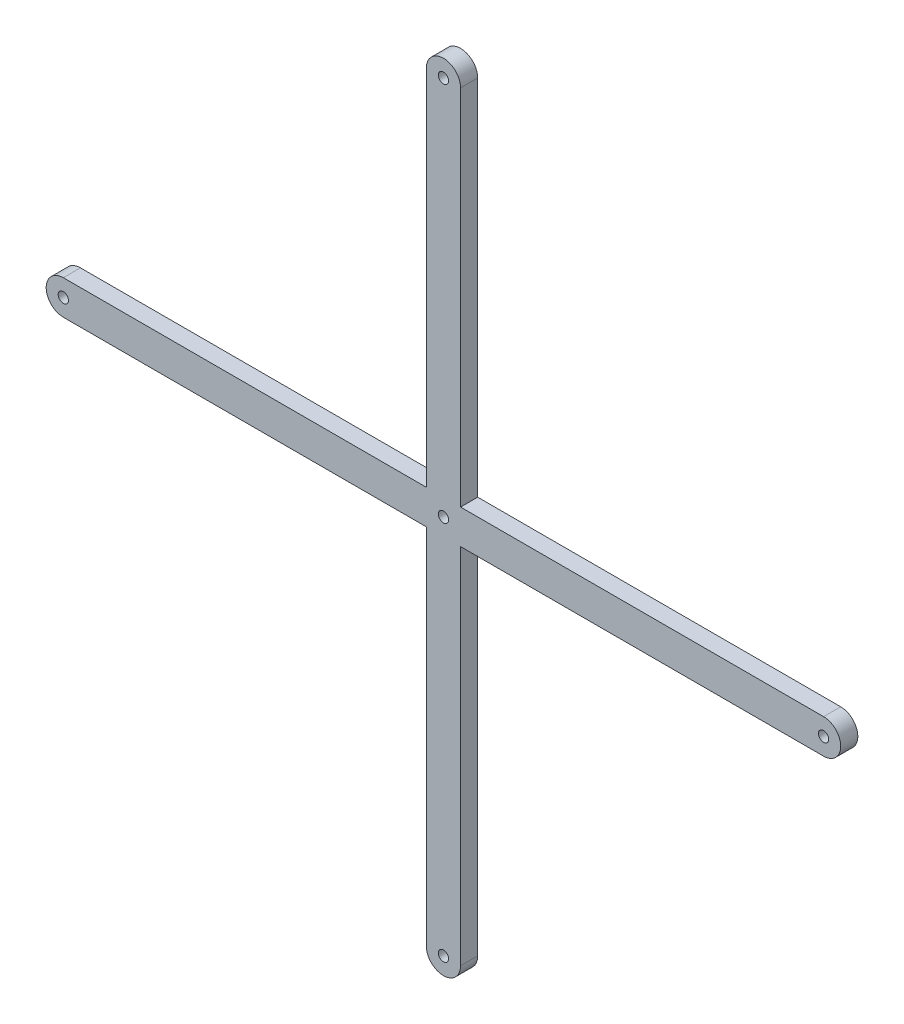
ISO-10303-21;
HEADER;
FILE_DESCRIPTION(('STEP AP214'),'2;1');
FILE_NAME('part.step','',(''),(''),'','','');
FILE_SCHEMA(('AUTOMOTIVE_DESIGN { 1 0 10303 214 1 1 1 1 }'));
ENDSEC;
DATA;
#1=APPLICATION_CONTEXT('core data for automotive mechanical design processes');
#2=APPLICATION_PROTOCOL_DEFINITION('international standard','automotive_design',2000,#1);
#3=PRODUCT_CONTEXT('',#1,'mechanical');
#4=PRODUCT('Part','Part','',(#3));
#5=PRODUCT_RELATED_PRODUCT_CATEGORY('part','',(#4));
#6=PRODUCT_DEFINITION_FORMATION('','',#4);
#7=PRODUCT_DEFINITION_CONTEXT('part definition',#1,'design');
#8=PRODUCT_DEFINITION('design','',#6,#7);
#9=PRODUCT_DEFINITION_SHAPE('','',#8);
#10=(LENGTH_UNIT() NAMED_UNIT(*) SI_UNIT(.MILLI.,.METRE.));
#11=(NAMED_UNIT(*) PLANE_ANGLE_UNIT() SI_UNIT($,.RADIAN.));
#12=(NAMED_UNIT(*) SI_UNIT($,.STERADIAN.) SOLID_ANGLE_UNIT());
#13=UNCERTAINTY_MEASURE_WITH_UNIT(LENGTH_MEASURE(1.E-05),#10,'distance_accuracy_value','');
#14=(GEOMETRIC_REPRESENTATION_CONTEXT(3) GLOBAL_UNCERTAINTY_ASSIGNED_CONTEXT((#13)) GLOBAL_UNIT_ASSIGNED_CONTEXT((#10,
#11,#12)) REPRESENTATION_CONTEXT('',''));
#15=CARTESIAN_POINT('',(0.,0.,0.));
#16=DIRECTION('',(0.,0.,1.));
#17=DIRECTION('',(1.,0.,0.));
#18=AXIS2_PLACEMENT_3D('',#15,#16,#17);
#19=CARTESIAN_POINT('',(0.,-111.,5.));
#20=DIRECTION('',(0.,0.,1.));
#21=DIRECTION('',(1.,0.,0.));
#22=AXIS2_PLACEMENT_3D('',#19,#20,#21);
#23=PLANE('',#22);
#24=CARTESIAN_POINT('',(7.6151527775264E-13,111.,5.));
#25=DIRECTION('',(0.,0.,1.));
#26=DIRECTION('',(1.,0.,0.));
#27=AXIS2_PLACEMENT_3D('',#24,#25,#26);
#28=CIRCLE('',#27,1.5);
#29=CARTESIAN_POINT('',(1.50000000000076,111.,5.));
#30=VERTEX_POINT('',#29);
#31=EDGE_CURVE('E300',#30,#30,#28,.T.);
#32=ORIENTED_EDGE('',*,*,#31,.F.);
#33=EDGE_LOOP('',(#32));
#34=FACE_BOUND('',#33,.T.);
#35=CARTESIAN_POINT('',(0.,-111.,5.));
#36=DIRECTION('',(0.,0.,1.));
#37=DIRECTION('',(1.,0.,0.));
#38=AXIS2_PLACEMENT_3D('',#35,#36,#37);
#39=CIRCLE('',#38,1.5);
#40=CARTESIAN_POINT('',(1.50000000000002,-111.,5.));
#41=VERTEX_POINT('',#40);
#42=EDGE_CURVE('E312',#41,#41,#39,.T.);
#43=ORIENTED_EDGE('',*,*,#42,.F.);
#44=EDGE_LOOP('',(#43));
#45=FACE_BOUND('',#44,.T.);
#46=CARTESIAN_POINT('',(0.,-111.,5.));
#47=DIRECTION('',(0.,0.,1.));
#48=DIRECTION('',(1.,0.,0.));
#49=AXIS2_PLACEMENT_3D('',#46,#47,#48);
#50=CIRCLE('',#49,5.);
#51=CARTESIAN_POINT('',(-4.99999999999999,-111.,5.));
#52=VERTEX_POINT('',#51);
#53=CARTESIAN_POINT('',(5.00000000000002,-111.,5.));
#54=VERTEX_POINT('',#53);
#55=EDGE_CURVE('E182',#52,#54,#50,.T.);
#56=ORIENTED_EDGE('',*,*,#55,.T.);
#57=DIRECTION('',(0.,1.,0.));
#58=VECTOR('',#57,1.);
#59=CARTESIAN_POINT('',(5.,-5.00000000000005,5.));
#60=LINE('',#59,#58);
#61=CARTESIAN_POINT('',(5.,-5.00000000000005,5.));
#62=VERTEX_POINT('',#61);
#63=EDGE_CURVE('E110',#54,#62,#60,.T.);
#64=ORIENTED_EDGE('',*,*,#63,.T.);
#65=DIRECTION('',(1.,0.,0.));
#66=VECTOR('',#65,1.);
#67=CARTESIAN_POINT('',(5.,-5.00000000000005,5.));
#68=LINE('',#67,#66);
#69=CARTESIAN_POINT('',(111.,-5.00000000000115,5.));
#70=VERTEX_POINT('',#69);
#71=EDGE_CURVE('E209',#62,#70,#68,.T.);
#72=ORIENTED_EDGE('',*,*,#71,.T.);
#73=CARTESIAN_POINT('',(110.999999999999,-1.15481006634941E-12,5.));
#74=DIRECTION('',(0.,0.,1.));
#75=DIRECTION('',(1.,0.,0.));
#76=AXIS2_PLACEMENT_3D('',#73,#74,#75);
#77=CIRCLE('',#76,5.);
#78=CARTESIAN_POINT('',(111.,4.99999999999885,5.));
#79=VERTEX_POINT('',#78);
#80=EDGE_CURVE('E228',#70,#79,#77,.T.);
#81=ORIENTED_EDGE('',*,*,#80,.T.);
#82=DIRECTION('',(-1.,0.,0.));
#83=VECTOR('',#82,1.);
#84=CARTESIAN_POINT('',(5.00000000000004,4.99999999999995,5.));
#85=LINE('',#84,#83);
#86=CARTESIAN_POINT('',(5.00000000000004,4.99999999999995,5.));
#87=VERTEX_POINT('',#86);
#88=EDGE_CURVE('E225',#79,#87,#85,.T.);
#89=ORIENTED_EDGE('',*,*,#88,.T.);
#90=DIRECTION('',(0.,1.,0.));
#91=VECTOR('',#90,1.);
#92=CARTESIAN_POINT('',(5.00000000000004,4.99999999999995,5.));
#93=LINE('',#92,#91);
#94=CARTESIAN_POINT('',(5.00000000000033,111.,5.));
#95=VERTEX_POINT('',#94);
#96=EDGE_CURVE('E227',#87,#95,#93,.T.);
#97=ORIENTED_EDGE('',*,*,#96,.T.);
#98=CARTESIAN_POINT('',(3.26412221820919E-13,111.,5.));
#99=DIRECTION('',(0.,0.,1.));
#100=DIRECTION('',(1.,0.,0.));
#101=AXIS2_PLACEMENT_3D('',#98,#99,#100);
#102=CIRCLE('',#101,5.);
#103=CARTESIAN_POINT('',(-4.99999999999968,111.,5.));
#104=VERTEX_POINT('',#103);
#105=EDGE_CURVE('E230',#95,#104,#102,.T.);
#106=ORIENTED_EDGE('',*,*,#105,.T.);
#107=DIRECTION('',(0.,-1.,0.));
#108=VECTOR('',#107,1.);
#109=CARTESIAN_POINT('',(-4.99999999999965,5.00000000000036,5.));
#110=LINE('',#109,#108);
#111=CARTESIAN_POINT('',(-4.99999999999965,5.00000000000036,5.));
#112=VERTEX_POINT('',#111);
#113=EDGE_CURVE('E236',#104,#112,#110,.T.);
#114=ORIENTED_EDGE('',*,*,#113,.T.);
#115=DIRECTION('',(-1.,0.,0.));
#116=VECTOR('',#115,1.);
#117=CARTESIAN_POINT('',(-4.99999999999965,5.00000000000036,5.));
#118=LINE('',#117,#116);
#119=CARTESIAN_POINT('',(-111.,5.00000000000033,5.));
#120=VERTEX_POINT('',#119);
#121=EDGE_CURVE('E141',#112,#120,#118,.T.);
#122=ORIENTED_EDGE('',*,*,#121,.T.);
#123=CARTESIAN_POINT('',(-111.,0.,5.));
#124=DIRECTION('',(0.,0.,1.));
#125=DIRECTION('',(1.,0.,0.));
#126=AXIS2_PLACEMENT_3D('',#123,#124,#125);
#127=CIRCLE('',#126,5.);
#128=CARTESIAN_POINT('',(-111.,-5.00000000000002,5.));
#129=VERTEX_POINT('',#128);
#130=EDGE_CURVE('E135',#120,#129,#127,.T.);
#131=ORIENTED_EDGE('',*,*,#130,.T.);
#132=DIRECTION('',(1.,0.,0.));
#133=VECTOR('',#132,1.);
#134=CARTESIAN_POINT('',(-5.00000000000036,-4.99999999999965,5.));
#135=LINE('',#134,#133);
#136=CARTESIAN_POINT('',(-5.00000000000036,-4.99999999999965,5.));
#137=VERTEX_POINT('',#136);
#138=EDGE_CURVE('E139',#129,#137,#135,.T.);
#139=ORIENTED_EDGE('',*,*,#138,.T.);
#140=DIRECTION('',(0.,-1.,0.));
#141=VECTOR('',#140,1.);
#142=CARTESIAN_POINT('',(-5.00000000000036,-4.99999999999965,5.));
#143=LINE('',#142,#141);
#144=EDGE_CURVE('E55',#137,#52,#143,.T.);
#145=ORIENTED_EDGE('',*,*,#144,.T.);
#146=EDGE_LOOP('',(#56,#64,#72,#81,#89,#97,#106,#114,#122,#131,#139,#145));
#147=FACE_BOUND('',#146,.T.);
#148=CARTESIAN_POINT('',(0.,0.,5.));
#149=DIRECTION('',(0.,0.,1.));
#150=DIRECTION('',(1.,0.,0.));
#151=AXIS2_PLACEMENT_3D('',#148,#149,#150);
#152=CIRCLE('',#151,1.5);
#153=CARTESIAN_POINT('',(1.5,0.,5.));
#154=VERTEX_POINT('',#153);
#155=EDGE_CURVE('E163',#154,#154,#152,.T.);
#156=ORIENTED_EDGE('',*,*,#155,.F.);
#157=EDGE_LOOP('',(#156));
#158=FACE_BOUND('',#157,.T.);
#159=CARTESIAN_POINT('',(-111.,3.73960849141052E-13,5.));
#160=DIRECTION('',(0.,0.,1.));
#161=DIRECTION('',(1.,0.,0.));
#162=AXIS2_PLACEMENT_3D('',#159,#160,#161);
#163=CIRCLE('',#162,1.5);
#164=CARTESIAN_POINT('',(-109.5,3.73960849141052E-13,5.));
#165=VERTEX_POINT('',#164);
#166=EDGE_CURVE('E306',#165,#165,#163,.T.);
#167=ORIENTED_EDGE('',*,*,#166,.F.);
#168=EDGE_LOOP('',(#167));
#169=FACE_BOUND('',#168,.T.);
#170=CARTESIAN_POINT('',(111.,-1.14906970636423E-12,5.));
#171=DIRECTION('',(0.,0.,1.));
#172=DIRECTION('',(1.,0.,0.));
#173=AXIS2_PLACEMENT_3D('',#170,#171,#172);
#174=CIRCLE('',#173,1.5);
#175=CARTESIAN_POINT('',(112.5,-1.14906970636423E-12,5.));
#176=VERTEX_POINT('',#175);
#177=EDGE_CURVE('E291',#176,#176,#174,.T.);
#178=ORIENTED_EDGE('',*,*,#177,.F.);
#179=EDGE_LOOP('',(#178));
#180=FACE_BOUND('',#179,.T.);
#181=ADVANCED_FACE('F38',(#34,#45,#147,#158,#169,#180),#23,.T.);
#182=CARTESIAN_POINT('',(0.,-111.,0.));
#183=DIRECTION('',(0.,0.,1.));
#184=DIRECTION('',(1.,0.,0.));
#185=AXIS2_PLACEMENT_3D('',#182,#183,#184);
#186=PLANE('',#185);
#187=CARTESIAN_POINT('',(0.,-111.,0.));
#188=DIRECTION('',(0.,0.,1.));
#189=DIRECTION('',(1.,0.,0.));
#190=AXIS2_PLACEMENT_3D('',#187,#188,#189);
#191=CIRCLE('',#190,5.);
#192=CARTESIAN_POINT('',(-4.99999999999999,-111.,0.));
#193=VERTEX_POINT('',#192);
#194=CARTESIAN_POINT('',(5.00000000000002,-111.,0.));
#195=VERTEX_POINT('',#194);
#196=EDGE_CURVE('E159',#193,#195,#191,.T.);
#197=ORIENTED_EDGE('',*,*,#196,.F.);
#198=DIRECTION('',(0.,-1.,0.));
#199=VECTOR('',#198,1.);
#200=CARTESIAN_POINT('',(-5.00000000000036,-4.99999999999965,0.));
#201=LINE('',#200,#199);
#202=CARTESIAN_POINT('',(-5.00000000000036,-4.99999999999965,0.));
#203=VERTEX_POINT('',#202);
#204=EDGE_CURVE('E102',#203,#193,#201,.T.);
#205=ORIENTED_EDGE('',*,*,#204,.F.);
#206=DIRECTION('',(1.,0.,0.));
#207=VECTOR('',#206,1.);
#208=CARTESIAN_POINT('',(-5.00000000000036,-4.99999999999965,0.));
#209=LINE('',#208,#207);
#210=CARTESIAN_POINT('',(-111.,-5.00000000000002,0.));
#211=VERTEX_POINT('',#210);
#212=EDGE_CURVE('E96',#211,#203,#209,.T.);
#213=ORIENTED_EDGE('',*,*,#212,.F.);
#214=CARTESIAN_POINT('',(-111.,0.,0.));
#215=DIRECTION('',(0.,0.,1.));
#216=DIRECTION('',(1.,0.,0.));
#217=AXIS2_PLACEMENT_3D('',#214,#215,#216);
#218=CIRCLE('',#217,5.);
#219=CARTESIAN_POINT('',(-111.,5.00000000000033,0.));
#220=VERTEX_POINT('',#219);
#221=EDGE_CURVE('E149',#220,#211,#218,.T.);
#222=ORIENTED_EDGE('',*,*,#221,.F.);
#223=DIRECTION('',(-1.,0.,0.));
#224=VECTOR('',#223,1.);
#225=CARTESIAN_POINT('',(-4.99999999999965,5.00000000000036,0.));
#226=LINE('',#225,#224);
#227=CARTESIAN_POINT('',(-4.99999999999965,5.00000000000036,0.));
#228=VERTEX_POINT('',#227);
#229=EDGE_CURVE('E177',#228,#220,#226,.T.);
#230=ORIENTED_EDGE('',*,*,#229,.F.);
#231=DIRECTION('',(0.,-1.,0.));
#232=VECTOR('',#231,1.);
#233=CARTESIAN_POINT('',(-4.99999999999965,5.00000000000036,0.));
#234=LINE('',#233,#232);
#235=CARTESIAN_POINT('',(-4.99999999999968,111.,0.));
#236=VERTEX_POINT('',#235);
#237=EDGE_CURVE('E175',#236,#228,#234,.T.);
#238=ORIENTED_EDGE('',*,*,#237,.F.);
#239=CARTESIAN_POINT('',(3.26412221820919E-13,111.,0.));
#240=DIRECTION('',(0.,0.,1.));
#241=DIRECTION('',(1.,0.,0.));
#242=AXIS2_PLACEMENT_3D('',#239,#240,#241);
#243=CIRCLE('',#242,5.);
#244=CARTESIAN_POINT('',(5.00000000000033,111.,0.));
#245=VERTEX_POINT('',#244);
#246=EDGE_CURVE('E173',#245,#236,#243,.T.);
#247=ORIENTED_EDGE('',*,*,#246,.F.);
#248=DIRECTION('',(0.,1.,0.));
#249=VECTOR('',#248,1.);
#250=CARTESIAN_POINT('',(5.00000000000004,4.99999999999995,0.));
#251=LINE('',#250,#249);
#252=CARTESIAN_POINT('',(5.00000000000004,4.99999999999995,0.));
#253=VERTEX_POINT('',#252);
#254=EDGE_CURVE('E171',#253,#245,#251,.T.);
#255=ORIENTED_EDGE('',*,*,#254,.F.);
#256=DIRECTION('',(-1.,0.,0.));
#257=VECTOR('',#256,1.);
#258=CARTESIAN_POINT('',(5.00000000000004,4.99999999999995,0.));
#259=LINE('',#258,#257);
#260=CARTESIAN_POINT('',(111.,4.99999999999885,0.));
#261=VERTEX_POINT('',#260);
#262=EDGE_CURVE('E169',#261,#253,#259,.T.);
#263=ORIENTED_EDGE('',*,*,#262,.F.);
#264=CARTESIAN_POINT('',(110.999999999999,-1.15481006634941E-12,0.));
#265=DIRECTION('',(0.,0.,1.));
#266=DIRECTION('',(1.,0.,0.));
#267=AXIS2_PLACEMENT_3D('',#264,#265,#266);
#268=CIRCLE('',#267,5.);
#269=CARTESIAN_POINT('',(111.,-5.00000000000115,0.));
#270=VERTEX_POINT('',#269);
#271=EDGE_CURVE('E167',#270,#261,#268,.T.);
#272=ORIENTED_EDGE('',*,*,#271,.F.);
#273=DIRECTION('',(1.,0.,0.));
#274=VECTOR('',#273,1.);
#275=CARTESIAN_POINT('',(5.,-5.00000000000005,0.));
#276=LINE('',#275,#274);
#277=CARTESIAN_POINT('',(5.,-5.00000000000005,0.));
#278=VERTEX_POINT('',#277);
#279=EDGE_CURVE('E165',#278,#270,#276,.T.);
#280=ORIENTED_EDGE('',*,*,#279,.F.);
#281=DIRECTION('',(0.,1.,0.));
#282=VECTOR('',#281,1.);
#283=CARTESIAN_POINT('',(5.,-5.00000000000005,0.));
#284=LINE('',#283,#282);
#285=EDGE_CURVE('E162',#195,#278,#284,.T.);
#286=ORIENTED_EDGE('',*,*,#285,.F.);
#287=EDGE_LOOP('',(#197,#205,#213,#222,#230,#238,#247,#255,#263,#272,#280,#286));
#288=FACE_BOUND('',#287,.T.);
#289=CARTESIAN_POINT('',(0.,0.,0.));
#290=DIRECTION('',(0.,0.,1.));
#291=DIRECTION('',(1.,0.,0.));
#292=AXIS2_PLACEMENT_3D('',#289,#290,#291);
#293=CIRCLE('',#292,1.5);
#294=CARTESIAN_POINT('',(1.5,0.,0.));
#295=VERTEX_POINT('',#294);
#296=EDGE_CURVE('E315',#295,#295,#293,.T.);
#297=ORIENTED_EDGE('',*,*,#296,.T.);
#298=EDGE_LOOP('',(#297));
#299=FACE_BOUND('',#298,.T.);
#300=CARTESIAN_POINT('',(0.,-111.,0.));
#301=DIRECTION('',(0.,0.,1.));
#302=DIRECTION('',(1.,0.,0.));
#303=AXIS2_PLACEMENT_3D('',#300,#301,#302);
#304=CIRCLE('',#303,1.5);
#305=CARTESIAN_POINT('',(1.50000000000002,-111.,0.));
#306=VERTEX_POINT('',#305);
#307=EDGE_CURVE('E309',#306,#306,#304,.T.);
#308=ORIENTED_EDGE('',*,*,#307,.T.);
#309=EDGE_LOOP('',(#308));
#310=FACE_BOUND('',#309,.T.);
#311=CARTESIAN_POINT('',(-111.,3.73960849141052E-13,0.));
#312=DIRECTION('',(0.,0.,1.));
#313=DIRECTION('',(1.,0.,0.));
#314=AXIS2_PLACEMENT_3D('',#311,#312,#313);
#315=CIRCLE('',#314,1.5);
#316=CARTESIAN_POINT('',(-109.5,3.73960849141052E-13,0.));
#317=VERTEX_POINT('',#316);
#318=EDGE_CURVE('E303',#317,#317,#315,.T.);
#319=ORIENTED_EDGE('',*,*,#318,.T.);
#320=EDGE_LOOP('',(#319));
#321=FACE_BOUND('',#320,.T.);
#322=CARTESIAN_POINT('',(7.6151527775264E-13,111.,0.));
#323=DIRECTION('',(0.,0.,1.));
#324=DIRECTION('',(1.,0.,0.));
#325=AXIS2_PLACEMENT_3D('',#322,#323,#324);
#326=CIRCLE('',#325,1.5);
#327=CARTESIAN_POINT('',(1.50000000000076,111.,0.));
#328=VERTEX_POINT('',#327);
#329=EDGE_CURVE('E297',#328,#328,#326,.T.);
#330=ORIENTED_EDGE('',*,*,#329,.T.);
#331=EDGE_LOOP('',(#330));
#332=FACE_BOUND('',#331,.T.);
#333=CARTESIAN_POINT('',(111.,-1.14906970636423E-12,0.));
#334=DIRECTION('',(0.,0.,1.));
#335=DIRECTION('',(1.,0.,0.));
#336=AXIS2_PLACEMENT_3D('',#333,#334,#335);
#337=CIRCLE('',#336,1.5);
#338=CARTESIAN_POINT('',(112.5,-1.14906970636423E-12,0.));
#339=VERTEX_POINT('',#338);
#340=EDGE_CURVE('E294',#339,#339,#337,.T.);
#341=ORIENTED_EDGE('',*,*,#340,.T.);
#342=EDGE_LOOP('',(#341));
#343=FACE_BOUND('',#342,.T.);
#344=ADVANCED_FACE('F213',(#288,#299,#310,#321,#332,#343),#186,.F.);
#345=CARTESIAN_POINT('',(0.,-111.,5.));
#346=DIRECTION('',(0.,0.,-1.));
#347=DIRECTION('',(-1.,0.,0.));
#348=AXIS2_PLACEMENT_3D('',#345,#346,#347);
#349=CYLINDRICAL_SURFACE('',#348,5.);
#350=ORIENTED_EDGE('',*,*,#196,.T.);
#351=DIRECTION('',(0.,0.,-1.));
#352=VECTOR('',#351,1.);
#353=CARTESIAN_POINT('',(5.00000000000002,-111.,5.));
#354=LINE('',#353,#352);
#355=EDGE_CURVE('E11',#54,#195,#354,.T.);
#356=ORIENTED_EDGE('',*,*,#355,.F.);
#357=ORIENTED_EDGE('',*,*,#55,.F.);
#358=DIRECTION('',(0.,0.,-1.));
#359=VECTOR('',#358,1.);
#360=CARTESIAN_POINT('',(-4.99999999999999,-111.,5.));
#361=LINE('',#360,#359);
#362=EDGE_CURVE('E155',#52,#193,#361,.T.);
#363=ORIENTED_EDGE('',*,*,#362,.T.);
#364=EDGE_LOOP('',(#350,#356,#357,#363));
#365=FACE_BOUND('',#364,.T.);
#366=ADVANCED_FACE('F40',(#365),#349,.T.);
#367=CARTESIAN_POINT('',(5.,-5.00000000000005,5.));
#368=DIRECTION('',(-1.,0.,0.));
#369=DIRECTION('',(0.,-1.,0.));
#370=AXIS2_PLACEMENT_3D('',#367,#368,#369);
#371=PLANE('',#370);
#372=ORIENTED_EDGE('',*,*,#285,.T.);
#373=DIRECTION('',(0.,0.,-1.));
#374=VECTOR('',#373,1.);
#375=CARTESIAN_POINT('',(5.,-5.00000000000005,5.));
#376=LINE('',#375,#374);
#377=EDGE_CURVE('E47',#62,#278,#376,.T.);
#378=ORIENTED_EDGE('',*,*,#377,.F.);
#379=ORIENTED_EDGE('',*,*,#63,.F.);
#380=ORIENTED_EDGE('',*,*,#355,.T.);
#381=EDGE_LOOP('',(#372,#378,#379,#380));
#382=FACE_BOUND('',#381,.T.);
#383=ADVANCED_FACE('F434',(#382),#371,.F.);
#384=CARTESIAN_POINT('',(5.,-5.00000000000005,5.));
#385=DIRECTION('',(0.,1.,0.));
#386=DIRECTION('',(-1.,0.,0.));
#387=AXIS2_PLACEMENT_3D('',#384,#385,#386);
#388=PLANE('',#387);
#389=ORIENTED_EDGE('',*,*,#279,.T.);
#390=DIRECTION('',(0.,0.,-1.));
#391=VECTOR('',#390,1.);
#392=CARTESIAN_POINT('',(111.,-5.00000000000115,5.));
#393=LINE('',#392,#391);
#394=EDGE_CURVE('E201',#70,#270,#393,.T.);
#395=ORIENTED_EDGE('',*,*,#394,.F.);
#396=ORIENTED_EDGE('',*,*,#71,.F.);
#397=ORIENTED_EDGE('',*,*,#377,.T.);
#398=EDGE_LOOP('',(#389,#395,#396,#397));
#399=FACE_BOUND('',#398,.T.);
#400=ADVANCED_FACE('F207',(#399),#388,.F.);
#401=CARTESIAN_POINT('',(110.999999999999,-1.15481006634941E-12,5.));
#402=DIRECTION('',(0.,0.,-1.));
#403=DIRECTION('',(-1.,0.,0.));
#404=AXIS2_PLACEMENT_3D('',#401,#402,#403);
#405=CYLINDRICAL_SURFACE('',#404,5.);
#406=ORIENTED_EDGE('',*,*,#271,.T.);
#407=DIRECTION('',(0.,0.,-1.));
#408=VECTOR('',#407,1.);
#409=CARTESIAN_POINT('',(111.,4.99999999999885,5.));
#410=LINE('',#409,#408);
#411=EDGE_CURVE('E198',#79,#261,#410,.T.);
#412=ORIENTED_EDGE('',*,*,#411,.F.);
#413=ORIENTED_EDGE('',*,*,#80,.F.);
#414=ORIENTED_EDGE('',*,*,#394,.T.);
#415=EDGE_LOOP('',(#406,#412,#413,#414));
#416=FACE_BOUND('',#415,.T.);
#417=ADVANCED_FACE('F219',(#416),#405,.T.);
#418=CARTESIAN_POINT('',(5.00000000000004,4.99999999999995,5.));
#419=DIRECTION('',(0.,-1.,0.));
#420=DIRECTION('',(1.,0.,0.));
#421=AXIS2_PLACEMENT_3D('',#418,#419,#420);
#422=PLANE('',#421);
#423=ORIENTED_EDGE('',*,*,#262,.T.);
#424=DIRECTION('',(0.,0.,-1.));
#425=VECTOR('',#424,1.);
#426=CARTESIAN_POINT('',(5.00000000000004,4.99999999999995,5.));
#427=LINE('',#426,#425);
#428=EDGE_CURVE('E195',#87,#253,#427,.T.);
#429=ORIENTED_EDGE('',*,*,#428,.F.);
#430=ORIENTED_EDGE('',*,*,#88,.F.);
#431=ORIENTED_EDGE('',*,*,#411,.T.);
#432=EDGE_LOOP('',(#423,#429,#430,#431));
#433=FACE_BOUND('',#432,.T.);
#434=ADVANCED_FACE('F223',(#433),#422,.F.);
#435=CARTESIAN_POINT('',(5.00000000000004,4.99999999999995,5.));
#436=DIRECTION('',(-1.,0.,0.));
#437=DIRECTION('',(0.,-1.,0.));
#438=AXIS2_PLACEMENT_3D('',#435,#436,#437);
#439=PLANE('',#438);
#440=ORIENTED_EDGE('',*,*,#254,.T.);
#441=DIRECTION('',(0.,0.,-1.));
#442=VECTOR('',#441,1.);
#443=CARTESIAN_POINT('',(5.00000000000033,111.,5.));
#444=LINE('',#443,#442);
#445=EDGE_CURVE('E192',#95,#245,#444,.T.);
#446=ORIENTED_EDGE('',*,*,#445,.F.);
#447=ORIENTED_EDGE('',*,*,#96,.F.);
#448=ORIENTED_EDGE('',*,*,#428,.T.);
#449=EDGE_LOOP('',(#440,#446,#447,#448));
#450=FACE_BOUND('',#449,.T.);
#451=ADVANCED_FACE('F399',(#450),#439,.F.);
#452=CARTESIAN_POINT('',(3.26412221820919E-13,111.,5.));
#453=DIRECTION('',(0.,0.,-1.));
#454=DIRECTION('',(-1.,0.,0.));
#455=AXIS2_PLACEMENT_3D('',#452,#453,#454);
#456=CYLINDRICAL_SURFACE('',#455,5.);
#457=ORIENTED_EDGE('',*,*,#246,.T.);
#458=DIRECTION('',(0.,0.,-1.));
#459=VECTOR('',#458,1.);
#460=CARTESIAN_POINT('',(-4.99999999999968,111.,5.));
#461=LINE('',#460,#459);
#462=EDGE_CURVE('E189',#104,#236,#461,.T.);
#463=ORIENTED_EDGE('',*,*,#462,.F.);
#464=ORIENTED_EDGE('',*,*,#105,.F.);
#465=ORIENTED_EDGE('',*,*,#445,.T.);
#466=EDGE_LOOP('',(#457,#463,#464,#465));
#467=FACE_BOUND('',#466,.T.);
#468=ADVANCED_FACE('F390',(#467),#456,.T.);
#469=CARTESIAN_POINT('',(-4.99999999999965,5.00000000000036,5.));
#470=DIRECTION('',(1.,0.,0.));
#471=DIRECTION('',(0.,1.,0.));
#472=AXIS2_PLACEMENT_3D('',#469,#470,#471);
#473=PLANE('',#472);
#474=ORIENTED_EDGE('',*,*,#237,.T.);
#475=DIRECTION('',(0.,0.,-1.));
#476=VECTOR('',#475,1.);
#477=CARTESIAN_POINT('',(-4.99999999999965,5.00000000000036,5.));
#478=LINE('',#477,#476);
#479=EDGE_CURVE('E186',#112,#228,#478,.T.);
#480=ORIENTED_EDGE('',*,*,#479,.F.);
#481=ORIENTED_EDGE('',*,*,#113,.F.);
#482=ORIENTED_EDGE('',*,*,#462,.T.);
#483=EDGE_LOOP('',(#474,#480,#481,#482));
#484=FACE_BOUND('',#483,.T.);
#485=ADVANCED_FACE('F242',(#484),#473,.F.);
#486=CARTESIAN_POINT('',(-4.99999999999965,5.00000000000036,5.));
#487=DIRECTION('',(0.,-1.,0.));
#488=DIRECTION('',(1.,0.,0.));
#489=AXIS2_PLACEMENT_3D('',#486,#487,#488);
#490=PLANE('',#489);
#491=ORIENTED_EDGE('',*,*,#229,.T.);
#492=DIRECTION('',(0.,0.,-1.));
#493=VECTOR('',#492,1.);
#494=CARTESIAN_POINT('',(-111.,5.00000000000033,5.));
#495=LINE('',#494,#493);
#496=EDGE_CURVE('E150',#120,#220,#495,.T.);
#497=ORIENTED_EDGE('',*,*,#496,.F.);
#498=ORIENTED_EDGE('',*,*,#121,.F.);
#499=ORIENTED_EDGE('',*,*,#479,.T.);
#500=EDGE_LOOP('',(#491,#497,#498,#499));
#501=FACE_BOUND('',#500,.T.);
#502=ADVANCED_FACE('F246',(#501),#490,.F.);
#503=CARTESIAN_POINT('',(-111.,0.,5.));
#504=DIRECTION('',(0.,0.,-1.));
#505=DIRECTION('',(-1.,0.,0.));
#506=AXIS2_PLACEMENT_3D('',#503,#504,#505);
#507=CYLINDRICAL_SURFACE('',#506,5.);
#508=ORIENTED_EDGE('',*,*,#221,.T.);
#509=DIRECTION('',(0.,0.,-1.));
#510=VECTOR('',#509,1.);
#511=CARTESIAN_POINT('',(-111.,-5.00000000000002,5.));
#512=LINE('',#511,#510);
#513=EDGE_CURVE('E146',#129,#211,#512,.T.);
#514=ORIENTED_EDGE('',*,*,#513,.F.);
#515=ORIENTED_EDGE('',*,*,#130,.F.);
#516=ORIENTED_EDGE('',*,*,#496,.T.);
#517=EDGE_LOOP('',(#508,#514,#515,#516));
#518=FACE_BOUND('',#517,.T.);
#519=ADVANCED_FACE('F147',(#518),#507,.T.);
#520=CARTESIAN_POINT('',(-5.00000000000036,-4.99999999999965,5.));
#521=DIRECTION('',(0.,1.,0.));
#522=DIRECTION('',(-1.,0.,0.));
#523=AXIS2_PLACEMENT_3D('',#520,#521,#522);
#524=PLANE('',#523);
#525=ORIENTED_EDGE('',*,*,#212,.T.);
#526=DIRECTION('',(0.,0.,-1.));
#527=VECTOR('',#526,1.);
#528=CARTESIAN_POINT('',(-5.00000000000036,-4.99999999999965,5.));
#529=LINE('',#528,#527);
#530=EDGE_CURVE('E151',#137,#203,#529,.T.);
#531=ORIENTED_EDGE('',*,*,#530,.F.);
#532=ORIENTED_EDGE('',*,*,#138,.F.);
#533=ORIENTED_EDGE('',*,*,#513,.T.);
#534=EDGE_LOOP('',(#525,#531,#532,#533));
#535=FACE_BOUND('',#534,.T.);
#536=ADVANCED_FACE('F153',(#535),#524,.F.);
#537=CARTESIAN_POINT('',(-5.00000000000036,-4.99999999999965,5.));
#538=DIRECTION('',(1.,0.,0.));
#539=DIRECTION('',(0.,1.,0.));
#540=AXIS2_PLACEMENT_3D('',#537,#538,#539);
#541=PLANE('',#540);
#542=ORIENTED_EDGE('',*,*,#204,.T.);
#543=ORIENTED_EDGE('',*,*,#362,.F.);
#544=ORIENTED_EDGE('',*,*,#144,.F.);
#545=ORIENTED_EDGE('',*,*,#530,.T.);
#546=EDGE_LOOP('',(#542,#543,#544,#545));
#547=FACE_BOUND('',#546,.T.);
#548=ADVANCED_FACE('F250',(#547),#541,.F.);
#549=CARTESIAN_POINT('',(0.,0.,5.));
#550=DIRECTION('',(0.,0.,-1.));
#551=DIRECTION('',(-1.,0.,0.));
#552=AXIS2_PLACEMENT_3D('',#549,#550,#551);
#553=CYLINDRICAL_SURFACE('',#552,1.5);
#554=ORIENTED_EDGE('',*,*,#155,.T.);
#555=EDGE_LOOP('',(#554));
#556=FACE_BOUND('',#555,.T.);
#557=ORIENTED_EDGE('',*,*,#296,.F.);
#558=EDGE_LOOP('',(#557));
#559=FACE_BOUND('',#558,.T.);
#560=ADVANCED_FACE('F252',(#556,#559),#553,.F.);
#561=CARTESIAN_POINT('',(0.,-111.,5.));
#562=DIRECTION('',(0.,0.,-1.));
#563=DIRECTION('',(-1.,0.,0.));
#564=AXIS2_PLACEMENT_3D('',#561,#562,#563);
#565=CYLINDRICAL_SURFACE('',#564,1.5);
#566=ORIENTED_EDGE('',*,*,#42,.T.);
#567=EDGE_LOOP('',(#566));
#568=FACE_BOUND('',#567,.T.);
#569=ORIENTED_EDGE('',*,*,#307,.F.);
#570=EDGE_LOOP('',(#569));
#571=FACE_BOUND('',#570,.T.);
#572=ADVANCED_FACE('F258',(#568,#571),#565,.F.);
#573=CARTESIAN_POINT('',(-111.,3.73960849141052E-13,5.));
#574=DIRECTION('',(0.,0.,-1.));
#575=DIRECTION('',(-1.,0.,0.));
#576=AXIS2_PLACEMENT_3D('',#573,#574,#575);
#577=CYLINDRICAL_SURFACE('',#576,1.5);
#578=ORIENTED_EDGE('',*,*,#166,.T.);
#579=EDGE_LOOP('',(#578));
#580=FACE_BOUND('',#579,.T.);
#581=ORIENTED_EDGE('',*,*,#318,.F.);
#582=EDGE_LOOP('',(#581));
#583=FACE_BOUND('',#582,.T.);
#584=ADVANCED_FACE('F274',(#580,#583),#577,.F.);
#585=CARTESIAN_POINT('',(7.6151527775264E-13,111.,5.));
#586=DIRECTION('',(0.,0.,-1.));
#587=DIRECTION('',(-1.,0.,0.));
#588=AXIS2_PLACEMENT_3D('',#585,#586,#587);
#589=CYLINDRICAL_SURFACE('',#588,1.5);
#590=ORIENTED_EDGE('',*,*,#31,.T.);
#591=EDGE_LOOP('',(#590));
#592=FACE_BOUND('',#591,.T.);
#593=ORIENTED_EDGE('',*,*,#329,.F.);
#594=EDGE_LOOP('',(#593));
#595=FACE_BOUND('',#594,.T.);
#596=ADVANCED_FACE('F278',(#592,#595),#589,.F.);
#597=CARTESIAN_POINT('',(111.,-1.14906970636423E-12,5.));
#598=DIRECTION('',(0.,0.,-1.));
#599=DIRECTION('',(-1.,0.,0.));
#600=AXIS2_PLACEMENT_3D('',#597,#598,#599);
#601=CYLINDRICAL_SURFACE('',#600,1.5);
#602=ORIENTED_EDGE('',*,*,#177,.T.);
#603=EDGE_LOOP('',(#602));
#604=FACE_BOUND('',#603,.T.);
#605=ORIENTED_EDGE('',*,*,#340,.F.);
#606=EDGE_LOOP('',(#605));
#607=FACE_BOUND('',#606,.T.);
#608=ADVANCED_FACE('F282',(#604,#607),#601,.F.);
#609=CLOSED_SHELL('',(#181,#344,#366,#383,#400,#417,#434,#451,#468,#485,#502,#519,#536,#548,
#560,#572,#584,#596,#608));
#610=MANIFOLD_SOLID_BREP('B2',#609);
#611=ADVANCED_BREP_SHAPE_REPRESENTATION('',(#18,#610),#14);
#612=SHAPE_DEFINITION_REPRESENTATION(#9,#611);
ENDSEC;
END-ISO-10303-21;
